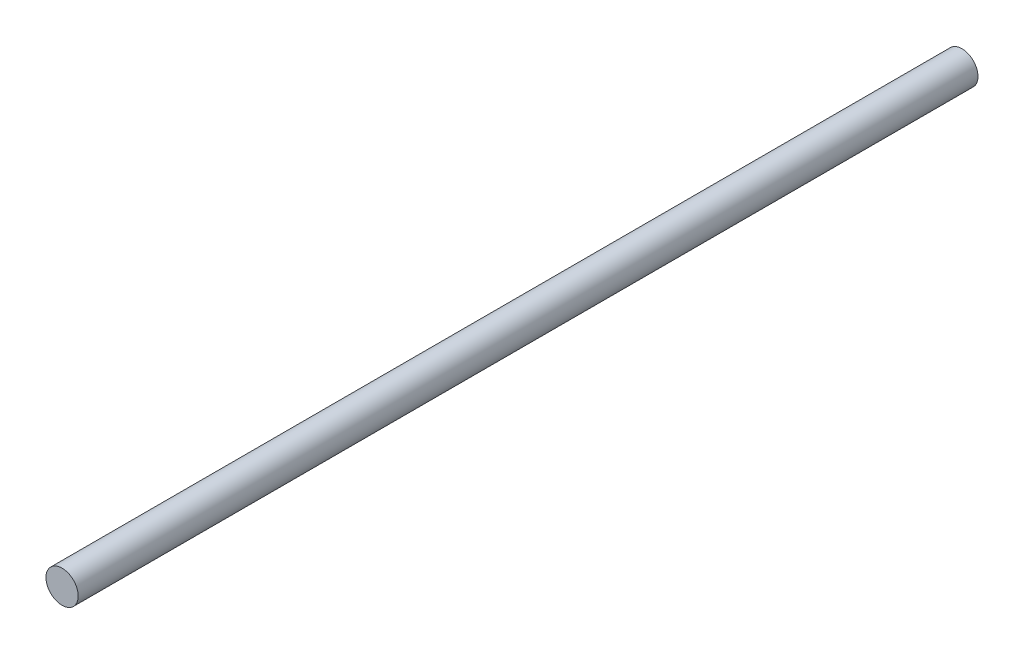
ISO-10303-21;
HEADER;
FILE_DESCRIPTION(('STEP AP214'),'2;1');
FILE_NAME('part.step','',(''),(''),'','','');
FILE_SCHEMA(('AUTOMOTIVE_DESIGN { 1 0 10303 214 1 1 1 1 }'));
ENDSEC;
DATA;
#1=APPLICATION_CONTEXT('core data for automotive mechanical design processes');
#2=APPLICATION_PROTOCOL_DEFINITION('international standard','automotive_design',2000,#1);
#3=PRODUCT_CONTEXT('',#1,'mechanical');
#4=PRODUCT('Part','Part','',(#3));
#5=PRODUCT_RELATED_PRODUCT_CATEGORY('part','',(#4));
#6=PRODUCT_DEFINITION_FORMATION('','',#4);
#7=PRODUCT_DEFINITION_CONTEXT('part definition',#1,'design');
#8=PRODUCT_DEFINITION('design','',#6,#7);
#9=PRODUCT_DEFINITION_SHAPE('','',#8);
#10=(LENGTH_UNIT() NAMED_UNIT(*) SI_UNIT(.MILLI.,.METRE.));
#11=(NAMED_UNIT(*) PLANE_ANGLE_UNIT() SI_UNIT($,.RADIAN.));
#12=(NAMED_UNIT(*) SI_UNIT($,.STERADIAN.) SOLID_ANGLE_UNIT());
#13=UNCERTAINTY_MEASURE_WITH_UNIT(LENGTH_MEASURE(1.E-05),#10,'distance_accuracy_value','');
#14=(GEOMETRIC_REPRESENTATION_CONTEXT(3) GLOBAL_UNCERTAINTY_ASSIGNED_CONTEXT((#13)) GLOBAL_UNIT_ASSIGNED_CONTEXT((#10,
#11,#12)) REPRESENTATION_CONTEXT('',''));
#15=CARTESIAN_POINT('',(0.,0.,0.));
#16=DIRECTION('',(0.,0.,1.));
#17=DIRECTION('',(1.,0.,0.));
#18=AXIS2_PLACEMENT_3D('',#15,#16,#17);
#19=CARTESIAN_POINT('',(0.,0.,83.82));
#20=DIRECTION('',(0.,0.,-1.));
#21=DIRECTION('',(-1.,0.,0.));
#22=AXIS2_PLACEMENT_3D('',#19,#20,#21);
#23=CYLINDRICAL_SURFACE('',#22,1.5);
#24=CARTESIAN_POINT('',(0.,0.,83.82));
#25=DIRECTION('',(0.,0.,1.));
#26=DIRECTION('',(1.,0.,0.));
#27=AXIS2_PLACEMENT_3D('',#24,#25,#26);
#28=CIRCLE('',#27,1.5);
#29=CARTESIAN_POINT('',(1.5,0.,83.82));
#30=VERTEX_POINT('',#29);
#31=EDGE_CURVE('E10',#30,#30,#28,.T.);
#32=ORIENTED_EDGE('',*,*,#31,.F.);
#33=EDGE_LOOP('',(#32));
#34=FACE_BOUND('',#33,.T.);
#35=CARTESIAN_POINT('',(0.,0.,0.));
#36=DIRECTION('',(0.,0.,1.));
#37=DIRECTION('',(1.,0.,0.));
#38=AXIS2_PLACEMENT_3D('',#35,#36,#37);
#39=CIRCLE('',#38,1.5);
#40=CARTESIAN_POINT('',(1.5,0.,0.));
#41=VERTEX_POINT('',#40);
#42=EDGE_CURVE('E40',#41,#41,#39,.T.);
#43=ORIENTED_EDGE('',*,*,#42,.T.);
#44=EDGE_LOOP('',(#43));
#45=FACE_BOUND('',#44,.T.);
#46=ADVANCED_FACE('F37',(#34,#45),#23,.T.);
#47=CARTESIAN_POINT('',(0.,0.,83.82));
#48=DIRECTION('',(0.,0.,1.));
#49=DIRECTION('',(1.,0.,0.));
#50=AXIS2_PLACEMENT_3D('',#47,#48,#49);
#51=PLANE('',#50);
#52=ORIENTED_EDGE('',*,*,#31,.T.);
#53=EDGE_LOOP('',(#52));
#54=FACE_BOUND('',#53,.T.);
#55=ADVANCED_FACE('F54',(#54),#51,.T.);
#56=CARTESIAN_POINT('',(0.,0.,0.));
#57=DIRECTION('',(0.,0.,1.));
#58=DIRECTION('',(1.,0.,0.));
#59=AXIS2_PLACEMENT_3D('',#56,#57,#58);
#60=PLANE('',#59);
#61=ORIENTED_EDGE('',*,*,#42,.F.);
#62=EDGE_LOOP('',(#61));
#63=FACE_BOUND('',#62,.T.);
#64=ADVANCED_FACE('F52',(#63),#60,.F.);
#65=CLOSED_SHELL('',(#46,#55,#64));
#66=MANIFOLD_SOLID_BREP('B2',#65);
#67=ADVANCED_BREP_SHAPE_REPRESENTATION('',(#18,#66),#14);
#68=SHAPE_DEFINITION_REPRESENTATION(#9,#67);
ENDSEC;
END-ISO-10303-21;
